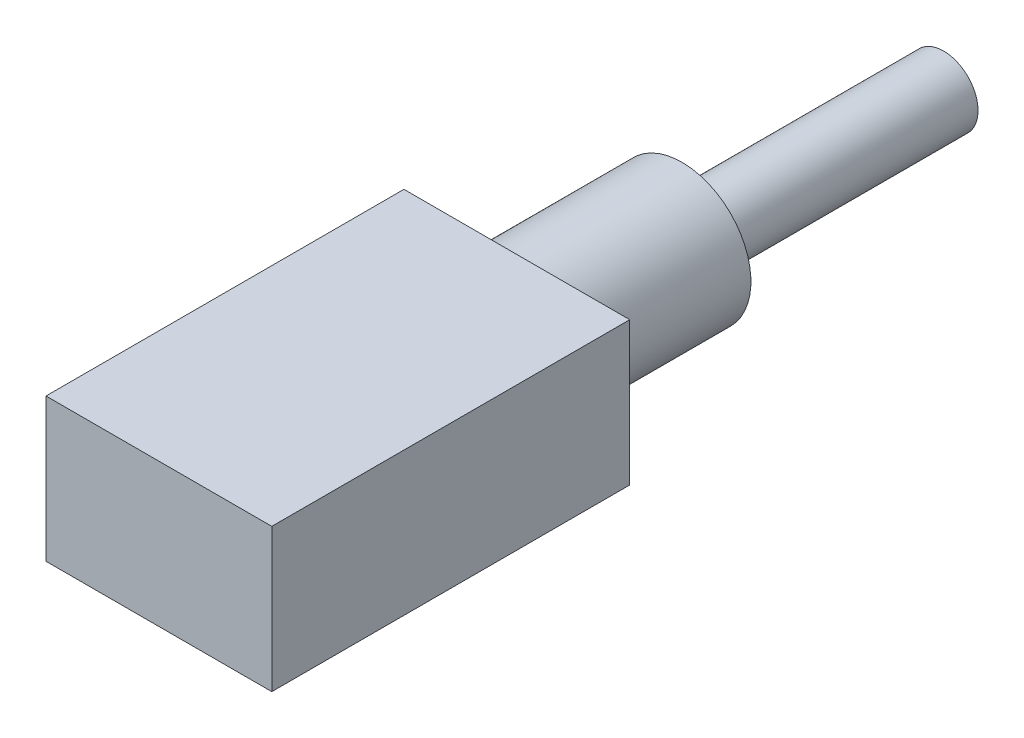
ISO-10303-21;
HEADER;
FILE_DESCRIPTION(('STEP AP214'),'2;1');
FILE_NAME('part.step','',(''),(''),'','','');
FILE_SCHEMA(('AUTOMOTIVE_DESIGN { 1 0 10303 214 1 1 1 1 }'));
ENDSEC;
DATA;
#1=APPLICATION_CONTEXT('core data for automotive mechanical design processes');
#2=APPLICATION_PROTOCOL_DEFINITION('international standard','automotive_design',2000,#1);
#3=PRODUCT_CONTEXT('',#1,'mechanical');
#4=PRODUCT('Part','Part','',(#3));
#5=PRODUCT_RELATED_PRODUCT_CATEGORY('part','',(#4));
#6=PRODUCT_DEFINITION_FORMATION('','',#4);
#7=PRODUCT_DEFINITION_CONTEXT('part definition',#1,'design');
#8=PRODUCT_DEFINITION('design','',#6,#7);
#9=PRODUCT_DEFINITION_SHAPE('','',#8);
#10=(LENGTH_UNIT() NAMED_UNIT(*) SI_UNIT(.MILLI.,.METRE.));
#11=(NAMED_UNIT(*) PLANE_ANGLE_UNIT() SI_UNIT($,.RADIAN.));
#12=(NAMED_UNIT(*) SI_UNIT($,.STERADIAN.) SOLID_ANGLE_UNIT());
#13=UNCERTAINTY_MEASURE_WITH_UNIT(LENGTH_MEASURE(1.E-05),#10,'distance_accuracy_value','');
#14=(GEOMETRIC_REPRESENTATION_CONTEXT(3) GLOBAL_UNCERTAINTY_ASSIGNED_CONTEXT((#13)) GLOBAL_UNIT_ASSIGNED_CONTEXT((#10,
#11,#12)) REPRESENTATION_CONTEXT('',''));
#15=CARTESIAN_POINT('',(0.,0.,0.));
#16=DIRECTION('',(0.,0.,1.));
#17=DIRECTION('',(1.,0.,0.));
#18=AXIS2_PLACEMENT_3D('',#15,#16,#17);
#19=CARTESIAN_POINT('',(-34.3655198451616,-49.3074440446684,13.));
#20=DIRECTION('',(-1.,0.,0.));
#21=DIRECTION('',(0.,0.,1.));
#22=AXIS2_PLACEMENT_3D('',#19,#20,#21);
#23=PLANE('',#22);
#24=DIRECTION('',(0.,1.,0.));
#25=VECTOR('',#24,1.);
#26=CARTESIAN_POINT('',(-34.3655198451616,-49.3074440446684,0.));
#27=LINE('',#26,#25);
#28=CARTESIAN_POINT('',(-34.3655198451616,-49.3074440446684,0.));
#29=VERTEX_POINT('',#28);
#30=CARTESIAN_POINT('',(-34.3655198451616,-44.1074440446684,0.));
#31=VERTEX_POINT('',#30);
#32=EDGE_CURVE('E100',#29,#31,#27,.T.);
#33=ORIENTED_EDGE('',*,*,#32,.T.);
#34=DIRECTION('',(0.,0.,-1.));
#35=VECTOR('',#34,1.);
#36=CARTESIAN_POINT('',(-34.3655198451616,-44.1074440446684,13.));
#37=LINE('',#36,#35);
#38=CARTESIAN_POINT('',(-34.3655198451616,-44.1074440446684,13.));
#39=VERTEX_POINT('',#38);
#40=EDGE_CURVE('E36',#39,#31,#37,.T.);
#41=ORIENTED_EDGE('',*,*,#40,.F.);
#42=DIRECTION('',(0.,1.,0.));
#43=VECTOR('',#42,1.);
#44=CARTESIAN_POINT('',(-34.3655198451616,-49.3074440446684,13.));
#45=LINE('',#44,#43);
#46=CARTESIAN_POINT('',(-34.3655198451616,-49.3074440446684,13.));
#47=VERTEX_POINT('',#46);
#48=EDGE_CURVE('E87',#47,#39,#45,.T.);
#49=ORIENTED_EDGE('',*,*,#48,.F.);
#50=DIRECTION('',(0.,0.,-1.));
#51=VECTOR('',#50,1.);
#52=CARTESIAN_POINT('',(-34.3655198451616,-49.3074440446684,13.));
#53=LINE('',#52,#51);
#54=EDGE_CURVE('E96',#47,#29,#53,.T.);
#55=ORIENTED_EDGE('',*,*,#54,.T.);
#56=EDGE_LOOP('',(#33,#41,#49,#55));
#57=FACE_BOUND('',#56,.T.);
#58=ADVANCED_FACE('F33',(#57),#23,.F.);
#59=CARTESIAN_POINT('',(-34.3655198451616,-44.1074440446684,13.));
#60=DIRECTION('',(0.,-1.,0.));
#61=DIRECTION('',(0.,0.,-1.));
#62=AXIS2_PLACEMENT_3D('',#59,#60,#61);
#63=PLANE('',#62);
#64=DIRECTION('',(-1.,0.,0.));
#65=VECTOR('',#64,1.);
#66=CARTESIAN_POINT('',(-34.3655198451616,-44.1074440446684,0.));
#67=LINE('',#66,#65);
#68=CARTESIAN_POINT('',(-42.5655198451616,-44.1074440446684,0.));
#69=VERTEX_POINT('',#68);
#70=EDGE_CURVE('E92',#31,#69,#67,.T.);
#71=ORIENTED_EDGE('',*,*,#70,.T.);
#72=DIRECTION('',(0.,0.,-1.));
#73=VECTOR('',#72,1.);
#74=CARTESIAN_POINT('',(-42.5655198451616,-44.1074440446684,13.));
#75=LINE('',#74,#73);
#76=CARTESIAN_POINT('',(-42.5655198451616,-44.1074440446684,13.));
#77=VERTEX_POINT('',#76);
#78=EDGE_CURVE('E90',#77,#69,#75,.T.);
#79=ORIENTED_EDGE('',*,*,#78,.F.);
#80=DIRECTION('',(-1.,0.,0.));
#81=VECTOR('',#80,1.);
#82=CARTESIAN_POINT('',(-34.3655198451616,-44.1074440446684,13.));
#83=LINE('',#82,#81);
#84=EDGE_CURVE('E82',#39,#77,#83,.T.);
#85=ORIENTED_EDGE('',*,*,#84,.F.);
#86=ORIENTED_EDGE('',*,*,#40,.T.);
#87=EDGE_LOOP('',(#71,#79,#85,#86));
#88=FACE_BOUND('',#87,.T.);
#89=ADVANCED_FACE('F91',(#88),#63,.F.);
#90=CARTESIAN_POINT('',(-42.5655198451616,-49.3074440446684,13.));
#91=DIRECTION('',(1.,0.,0.));
#92=DIRECTION('',(0.,0.,-1.));
#93=AXIS2_PLACEMENT_3D('',#90,#91,#92);
#94=PLANE('',#93);
#95=DIRECTION('',(0.,-1.,0.));
#96=VECTOR('',#95,1.);
#97=CARTESIAN_POINT('',(-42.5655198451616,-49.3074440446684,0.));
#98=LINE('',#97,#96);
#99=CARTESIAN_POINT('',(-42.5655198451616,-49.3074440446684,0.));
#100=VERTEX_POINT('',#99);
#101=EDGE_CURVE('E68',#69,#100,#98,.T.);
#102=ORIENTED_EDGE('',*,*,#101,.T.);
#103=DIRECTION('',(0.,0.,-1.));
#104=VECTOR('',#103,1.);
#105=CARTESIAN_POINT('',(-42.5655198451616,-49.3074440446684,13.));
#106=LINE('',#105,#104);
#107=CARTESIAN_POINT('',(-42.5655198451616,-49.3074440446684,13.));
#108=VERTEX_POINT('',#107);
#109=EDGE_CURVE('E93',#108,#100,#106,.T.);
#110=ORIENTED_EDGE('',*,*,#109,.F.);
#111=DIRECTION('',(0.,-1.,0.));
#112=VECTOR('',#111,1.);
#113=CARTESIAN_POINT('',(-42.5655198451616,-49.3074440446684,13.));
#114=LINE('',#113,#112);
#115=EDGE_CURVE('E85',#77,#108,#114,.T.);
#116=ORIENTED_EDGE('',*,*,#115,.F.);
#117=ORIENTED_EDGE('',*,*,#78,.T.);
#118=EDGE_LOOP('',(#102,#110,#116,#117));
#119=FACE_BOUND('',#118,.T.);
#120=ADVANCED_FACE('F94',(#119),#94,.F.);
#121=CARTESIAN_POINT('',(-34.3655198451616,-49.3074440446684,13.));
#122=DIRECTION('',(0.,1.,0.));
#123=DIRECTION('',(0.,0.,1.));
#124=AXIS2_PLACEMENT_3D('',#121,#122,#123);
#125=PLANE('',#124);
#126=DIRECTION('',(1.,0.,0.));
#127=VECTOR('',#126,1.);
#128=CARTESIAN_POINT('',(-34.3655198451616,-49.3074440446684,0.));
#129=LINE('',#128,#127);
#130=EDGE_CURVE('E74',#100,#29,#129,.T.);
#131=ORIENTED_EDGE('',*,*,#130,.T.);
#132=ORIENTED_EDGE('',*,*,#54,.F.);
#133=DIRECTION('',(1.,0.,0.));
#134=VECTOR('',#133,1.);
#135=CARTESIAN_POINT('',(-34.3655198451616,-49.3074440446684,13.));
#136=LINE('',#135,#134);
#137=EDGE_CURVE('E51',#108,#47,#136,.T.);
#138=ORIENTED_EDGE('',*,*,#137,.F.);
#139=ORIENTED_EDGE('',*,*,#109,.T.);
#140=EDGE_LOOP('',(#131,#132,#138,#139));
#141=FACE_BOUND('',#140,.T.);
#142=ADVANCED_FACE('F108',(#141),#125,.F.);
#143=CARTESIAN_POINT('',(0.,0.,13.));
#144=DIRECTION('',(0.,0.,1.));
#145=DIRECTION('',(1.,0.,0.));
#146=AXIS2_PLACEMENT_3D('',#143,#144,#145);
#147=PLANE('',#146);
#148=ORIENTED_EDGE('',*,*,#48,.T.);
#149=ORIENTED_EDGE('',*,*,#84,.T.);
#150=ORIENTED_EDGE('',*,*,#115,.T.);
#151=ORIENTED_EDGE('',*,*,#137,.T.);
#152=EDGE_LOOP('',(#148,#149,#150,#151));
#153=FACE_BOUND('',#152,.T.);
#154=ADVANCED_FACE('F83',(#153),#147,.T.);
#155=CARTESIAN_POINT('',(0.,0.,0.));
#156=DIRECTION('',(0.,0.,1.));
#157=DIRECTION('',(1.,0.,0.));
#158=AXIS2_PLACEMENT_3D('',#155,#156,#157);
#159=PLANE('',#158);
#160=CARTESIAN_POINT('',(-38.4655198451616,-46.7074440446684,0.));
#161=DIRECTION('',(0.,0.,-1.));
#162=DIRECTION('',(-1.,0.,0.));
#163=AXIS2_PLACEMENT_3D('',#160,#161,#162);
#164=CIRCLE('',#163,2.5);
#165=CARTESIAN_POINT('',(-40.9655198451616,-46.7074440446684,0.));
#166=VERTEX_POINT('',#165);
#167=EDGE_CURVE('E42',#166,#166,#164,.T.);
#168=ORIENTED_EDGE('',*,*,#167,.F.);
#169=EDGE_LOOP('',(#168));
#170=FACE_BOUND('',#169,.T.);
#171=ORIENTED_EDGE('',*,*,#32,.F.);
#172=ORIENTED_EDGE('',*,*,#130,.F.);
#173=ORIENTED_EDGE('',*,*,#101,.F.);
#174=ORIENTED_EDGE('',*,*,#70,.F.);
#175=EDGE_LOOP('',(#171,#172,#173,#174));
#176=FACE_BOUND('',#175,.T.);
#177=ADVANCED_FACE('F111',(#170,#176),#159,.F.);
#178=CARTESIAN_POINT('',(-38.4655198451616,-46.7074440446684,-6.));
#179=DIRECTION('',(0.,0.,1.));
#180=DIRECTION('',(1.,0.,0.));
#181=AXIS2_PLACEMENT_3D('',#178,#179,#180);
#182=CYLINDRICAL_SURFACE('',#181,2.5);
#183=CARTESIAN_POINT('',(-38.4655198451616,-46.7074440446684,-6.));
#184=DIRECTION('',(0.,0.,-1.));
#185=DIRECTION('',(-1.,0.,0.));
#186=AXIS2_PLACEMENT_3D('',#183,#184,#185);
#187=CIRCLE('',#186,2.5);
#188=CARTESIAN_POINT('',(-40.9655198451616,-46.7074440446684,-6.));
#189=VERTEX_POINT('',#188);
#190=EDGE_CURVE('E103',#189,#189,#187,.T.);
#191=ORIENTED_EDGE('',*,*,#190,.F.);
#192=EDGE_LOOP('',(#191));
#193=FACE_BOUND('',#192,.T.);
#194=ORIENTED_EDGE('',*,*,#167,.T.);
#195=EDGE_LOOP('',(#194));
#196=FACE_BOUND('',#195,.T.);
#197=ADVANCED_FACE('F133',(#193,#196),#182,.T.);
#198=CARTESIAN_POINT('',(-38.4655198451616,-46.7074440446684,-6.));
#199=DIRECTION('',(0.,0.,-1.));
#200=DIRECTION('',(-1.,0.,0.));
#201=AXIS2_PLACEMENT_3D('',#198,#199,#200);
#202=PLANE('',#201);
#203=CARTESIAN_POINT('',(-38.4655198451616,-46.7074440446684,-6.));
#204=DIRECTION('',(0.,0.,-1.));
#205=DIRECTION('',(-1.,0.,0.));
#206=AXIS2_PLACEMENT_3D('',#203,#204,#205);
#207=CIRCLE('',#206,1.25);
#208=CARTESIAN_POINT('',(-39.7155198451616,-46.7074440446684,-6.));
#209=VERTEX_POINT('',#208);
#210=EDGE_CURVE('E11',#209,#209,#207,.T.);
#211=ORIENTED_EDGE('',*,*,#210,.F.);
#212=EDGE_LOOP('',(#211));
#213=FACE_BOUND('',#212,.T.);
#214=ORIENTED_EDGE('',*,*,#190,.T.);
#215=EDGE_LOOP('',(#214));
#216=FACE_BOUND('',#215,.T.);
#217=ADVANCED_FACE('F127',(#213,#216),#202,.T.);
#218=CARTESIAN_POINT('',(-38.4655198451616,-46.7074440446684,-15.5));
#219=DIRECTION('',(0.,0.,1.));
#220=DIRECTION('',(1.,0.,0.));
#221=AXIS2_PLACEMENT_3D('',#218,#219,#220);
#222=CYLINDRICAL_SURFACE('',#221,1.25);
#223=CARTESIAN_POINT('',(-38.4655198451616,-46.7074440446684,-15.5));
#224=DIRECTION('',(0.,0.,-1.));
#225=DIRECTION('',(-1.,0.,0.));
#226=AXIS2_PLACEMENT_3D('',#223,#224,#225);
#227=CIRCLE('',#226,1.25);
#228=CARTESIAN_POINT('',(-39.7155198451616,-46.7074440446684,-15.5));
#229=VERTEX_POINT('',#228);
#230=EDGE_CURVE('E117',#229,#229,#227,.T.);
#231=ORIENTED_EDGE('',*,*,#230,.F.);
#232=EDGE_LOOP('',(#231));
#233=FACE_BOUND('',#232,.T.);
#234=ORIENTED_EDGE('',*,*,#210,.T.);
#235=EDGE_LOOP('',(#234));
#236=FACE_BOUND('',#235,.T.);
#237=ADVANCED_FACE('F124',(#233,#236),#222,.T.);
#238=CARTESIAN_POINT('',(-38.4655198451616,-46.7074440446684,-15.5));
#239=DIRECTION('',(0.,0.,-1.));
#240=DIRECTION('',(-1.,0.,0.));
#241=AXIS2_PLACEMENT_3D('',#238,#239,#240);
#242=PLANE('',#241);
#243=ORIENTED_EDGE('',*,*,#230,.T.);
#244=EDGE_LOOP('',(#243));
#245=FACE_BOUND('',#244,.T.);
#246=ADVANCED_FACE('F122',(#245),#242,.T.);
#247=CLOSED_SHELL('',(#58,#89,#120,#142,#154,#177,#197,#217,#237,#246));
#248=MANIFOLD_SOLID_BREP('B2',#247);
#249=ADVANCED_BREP_SHAPE_REPRESENTATION('',(#18,#248),#14);
#250=SHAPE_DEFINITION_REPRESENTATION(#9,#249);
ENDSEC;
END-ISO-10303-21;
